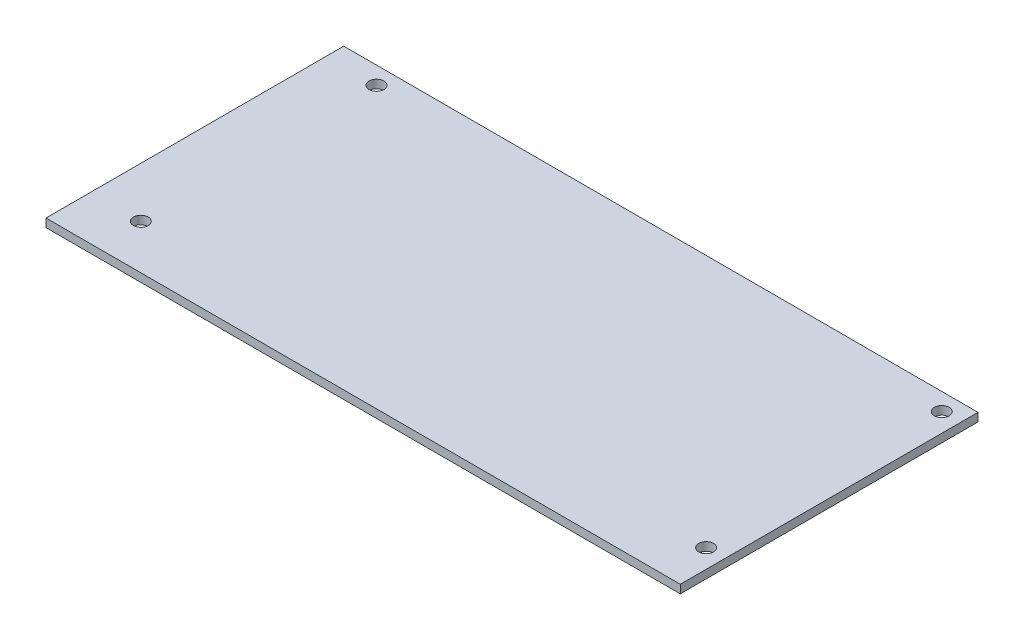
ISO-10303-21;
HEADER;
FILE_DESCRIPTION(('STEP AP214'),'2;1');
FILE_NAME('part.step','',(''),(''),'','','');
FILE_SCHEMA(('AUTOMOTIVE_DESIGN { 1 0 10303 214 1 1 1 1 }'));
ENDSEC;
DATA;
#1=APPLICATION_CONTEXT('core data for automotive mechanical design processes');
#2=APPLICATION_PROTOCOL_DEFINITION('international standard','automotive_design',2000,#1);
#3=PRODUCT_CONTEXT('',#1,'mechanical');
#4=PRODUCT('Part','Part','',(#3));
#5=PRODUCT_RELATED_PRODUCT_CATEGORY('part','',(#4));
#6=PRODUCT_DEFINITION_FORMATION('','',#4);
#7=PRODUCT_DEFINITION_CONTEXT('part definition',#1,'design');
#8=PRODUCT_DEFINITION('design','',#6,#7);
#9=PRODUCT_DEFINITION_SHAPE('','',#8);
#10=(LENGTH_UNIT() NAMED_UNIT(*) SI_UNIT(.MILLI.,.METRE.));
#11=(NAMED_UNIT(*) PLANE_ANGLE_UNIT() SI_UNIT($,.RADIAN.));
#12=(NAMED_UNIT(*) SI_UNIT($,.STERADIAN.) SOLID_ANGLE_UNIT());
#13=UNCERTAINTY_MEASURE_WITH_UNIT(LENGTH_MEASURE(1.E-05),#10,'distance_accuracy_value','');
#14=(GEOMETRIC_REPRESENTATION_CONTEXT(3) GLOBAL_UNCERTAINTY_ASSIGNED_CONTEXT((#13)) GLOBAL_UNIT_ASSIGNED_CONTEXT((#10,
#11,#12)) REPRESENTATION_CONTEXT('',''));
#15=CARTESIAN_POINT('',(0.,0.,0.));
#16=DIRECTION('',(0.,0.,1.));
#17=DIRECTION('',(1.,0.,0.));
#18=AXIS2_PLACEMENT_3D('',#15,#16,#17);
#19=CARTESIAN_POINT('',(-68.5,1.8,-32.15));
#20=DIRECTION('',(1.,0.,0.));
#21=DIRECTION('',(0.,0.,-1.));
#22=AXIS2_PLACEMENT_3D('',#19,#20,#21);
#23=PLANE('',#22);
#24=DIRECTION('',(0.,0.,1.));
#25=VECTOR('',#24,1.);
#26=CARTESIAN_POINT('',(-68.5,0.,-32.15));
#27=LINE('',#26,#25);
#28=CARTESIAN_POINT('',(-68.5,0.,-32.15));
#29=VERTEX_POINT('',#28);
#30=CARTESIAN_POINT('',(-68.5,0.,32.15));
#31=VERTEX_POINT('',#30);
#32=EDGE_CURVE('E99',#29,#31,#27,.T.);
#33=ORIENTED_EDGE('',*,*,#32,.T.);
#34=DIRECTION('',(0.,-1.,0.));
#35=VECTOR('',#34,1.);
#36=CARTESIAN_POINT('',(-68.5,1.8,32.15));
#37=LINE('',#36,#35);
#38=CARTESIAN_POINT('',(-68.5,1.8,32.15));
#39=VERTEX_POINT('',#38);
#40=EDGE_CURVE('E11',#39,#31,#37,.T.);
#41=ORIENTED_EDGE('',*,*,#40,.F.);
#42=DIRECTION('',(0.,0.,1.));
#43=VECTOR('',#42,1.);
#44=CARTESIAN_POINT('',(-68.5,1.8,-32.15));
#45=LINE('',#44,#43);
#46=CARTESIAN_POINT('',(-68.5,1.8,-32.15));
#47=VERTEX_POINT('',#46);
#48=EDGE_CURVE('E86',#47,#39,#45,.T.);
#49=ORIENTED_EDGE('',*,*,#48,.F.);
#50=DIRECTION('',(0.,-1.,0.));
#51=VECTOR('',#50,1.);
#52=CARTESIAN_POINT('',(-68.5,1.8,-32.15));
#53=LINE('',#52,#51);
#54=EDGE_CURVE('E95',#47,#29,#53,.T.);
#55=ORIENTED_EDGE('',*,*,#54,.T.);
#56=EDGE_LOOP('',(#33,#41,#49,#55));
#57=FACE_BOUND('',#56,.T.);
#58=ADVANCED_FACE('F33',(#57),#23,.F.);
#59=CARTESIAN_POINT('',(68.5,1.8,32.15));
#60=DIRECTION('',(0.,0.,-1.));
#61=DIRECTION('',(-1.,0.,0.));
#62=AXIS2_PLACEMENT_3D('',#59,#60,#61);
#63=PLANE('',#62);
#64=DIRECTION('',(1.,0.,0.));
#65=VECTOR('',#64,1.);
#66=CARTESIAN_POINT('',(68.5,0.,32.15));
#67=LINE('',#66,#65);
#68=CARTESIAN_POINT('',(68.5,0.,32.15));
#69=VERTEX_POINT('',#68);
#70=EDGE_CURVE('E90',#31,#69,#67,.T.);
#71=ORIENTED_EDGE('',*,*,#70,.T.);
#72=DIRECTION('',(0.,-1.,0.));
#73=VECTOR('',#72,1.);
#74=CARTESIAN_POINT('',(68.5,1.8,32.15));
#75=LINE('',#74,#73);
#76=CARTESIAN_POINT('',(68.5,1.8,32.15));
#77=VERTEX_POINT('',#76);
#78=EDGE_CURVE('E42',#77,#69,#75,.T.);
#79=ORIENTED_EDGE('',*,*,#78,.F.);
#80=DIRECTION('',(1.,0.,0.));
#81=VECTOR('',#80,1.);
#82=CARTESIAN_POINT('',(68.5,1.8,32.15));
#83=LINE('',#82,#81);
#84=EDGE_CURVE('E81',#39,#77,#83,.T.);
#85=ORIENTED_EDGE('',*,*,#84,.F.);
#86=ORIENTED_EDGE('',*,*,#40,.T.);
#87=EDGE_LOOP('',(#71,#79,#85,#86));
#88=FACE_BOUND('',#87,.T.);
#89=ADVANCED_FACE('F89',(#88),#63,.F.);
#90=CARTESIAN_POINT('',(68.5,1.8,-32.15));
#91=DIRECTION('',(-1.,0.,0.));
#92=DIRECTION('',(0.,0.,1.));
#93=AXIS2_PLACEMENT_3D('',#90,#91,#92);
#94=PLANE('',#93);
#95=DIRECTION('',(0.,0.,-1.));
#96=VECTOR('',#95,1.);
#97=CARTESIAN_POINT('',(68.5,0.,-32.15));
#98=LINE('',#97,#96);
#99=CARTESIAN_POINT('',(68.5,0.,-32.15));
#100=VERTEX_POINT('',#99);
#101=EDGE_CURVE('E68',#69,#100,#98,.T.);
#102=ORIENTED_EDGE('',*,*,#101,.T.);
#103=DIRECTION('',(0.,-1.,0.));
#104=VECTOR('',#103,1.);
#105=CARTESIAN_POINT('',(68.5,1.8,-32.15));
#106=LINE('',#105,#104);
#107=CARTESIAN_POINT('',(68.5,1.8,-32.15));
#108=VERTEX_POINT('',#107);
#109=EDGE_CURVE('E91',#108,#100,#106,.T.);
#110=ORIENTED_EDGE('',*,*,#109,.F.);
#111=DIRECTION('',(0.,0.,-1.));
#112=VECTOR('',#111,1.);
#113=CARTESIAN_POINT('',(68.5,1.8,-32.15));
#114=LINE('',#113,#112);
#115=EDGE_CURVE('E84',#77,#108,#114,.T.);
#116=ORIENTED_EDGE('',*,*,#115,.F.);
#117=ORIENTED_EDGE('',*,*,#78,.T.);
#118=EDGE_LOOP('',(#102,#110,#116,#117));
#119=FACE_BOUND('',#118,.T.);
#120=ADVANCED_FACE('F93',(#119),#94,.F.);
#121=CARTESIAN_POINT('',(68.5,1.8,-32.15));
#122=DIRECTION('',(0.,0.,1.));
#123=DIRECTION('',(1.,0.,0.));
#124=AXIS2_PLACEMENT_3D('',#121,#122,#123);
#125=PLANE('',#124);
#126=DIRECTION('',(-1.,0.,0.));
#127=VECTOR('',#126,1.);
#128=CARTESIAN_POINT('',(68.5,0.,-32.15));
#129=LINE('',#128,#127);
#130=EDGE_CURVE('E74',#100,#29,#129,.T.);
#131=ORIENTED_EDGE('',*,*,#130,.T.);
#132=ORIENTED_EDGE('',*,*,#54,.F.);
#133=DIRECTION('',(-1.,0.,0.));
#134=VECTOR('',#133,1.);
#135=CARTESIAN_POINT('',(68.5,1.8,-32.15));
#136=LINE('',#135,#134);
#137=EDGE_CURVE('E51',#108,#47,#136,.T.);
#138=ORIENTED_EDGE('',*,*,#137,.F.);
#139=ORIENTED_EDGE('',*,*,#109,.T.);
#140=EDGE_LOOP('',(#131,#132,#138,#139));
#141=FACE_BOUND('',#140,.T.);
#142=ADVANCED_FACE('F140',(#141),#125,.F.);
#143=CARTESIAN_POINT('',(0.,1.8,0.));
#144=DIRECTION('',(0.,-1.,0.));
#145=DIRECTION('',(0.,0.,-1.));
#146=AXIS2_PLACEMENT_3D('',#143,#144,#145);
#147=PLANE('',#146);
#148=CARTESIAN_POINT('',(-57.65,1.8,22.52));
#149=DIRECTION('',(0.,1.,0.));
#150=DIRECTION('',(0.,0.,1.));
#151=AXIS2_PLACEMENT_3D('',#148,#149,#150);
#152=CIRCLE('',#151,1.6);
#153=CARTESIAN_POINT('',(-57.65,1.8,24.12));
#154=VERTEX_POINT('',#153);
#155=EDGE_CURVE('E114',#154,#154,#152,.T.);
#156=ORIENTED_EDGE('',*,*,#155,.F.);
#157=EDGE_LOOP('',(#156));
#158=FACE_BOUND('',#157,.T.);
#159=CARTESIAN_POINT('',(64.45,1.8,-28.38));
#160=DIRECTION('',(0.,1.,0.));
#161=DIRECTION('',(0.,0.,1.));
#162=AXIS2_PLACEMENT_3D('',#159,#160,#161);
#163=CIRCLE('',#162,1.6);
#164=CARTESIAN_POINT('',(64.45,1.8,-26.78));
#165=VERTEX_POINT('',#164);
#166=EDGE_CURVE('E129',#165,#165,#163,.T.);
#167=ORIENTED_EDGE('',*,*,#166,.F.);
#168=EDGE_LOOP('',(#167));
#169=FACE_BOUND('',#168,.T.);
#170=CARTESIAN_POINT('',(64.45,1.8,22.52));
#171=DIRECTION('',(0.,1.,0.));
#172=DIRECTION('',(0.,0.,1.));
#173=AXIS2_PLACEMENT_3D('',#170,#171,#172);
#174=CIRCLE('',#173,1.6);
#175=CARTESIAN_POINT('',(64.45,1.8,24.12));
#176=VERTEX_POINT('',#175);
#177=EDGE_CURVE('E126',#176,#176,#174,.T.);
#178=ORIENTED_EDGE('',*,*,#177,.F.);
#179=EDGE_LOOP('',(#178));
#180=FACE_BOUND('',#179,.T.);
#181=CARTESIAN_POINT('',(-57.65,1.8,-28.38));
#182=DIRECTION('',(0.,1.,0.));
#183=DIRECTION('',(0.,0.,1.));
#184=AXIS2_PLACEMENT_3D('',#181,#182,#183);
#185=CIRCLE('',#184,1.6);
#186=CARTESIAN_POINT('',(-57.65,1.8,-26.78));
#187=VERTEX_POINT('',#186);
#188=EDGE_CURVE('E110',#187,#187,#185,.T.);
#189=ORIENTED_EDGE('',*,*,#188,.F.);
#190=EDGE_LOOP('',(#189));
#191=FACE_BOUND('',#190,.T.);
#192=ORIENTED_EDGE('',*,*,#48,.T.);
#193=ORIENTED_EDGE('',*,*,#84,.T.);
#194=ORIENTED_EDGE('',*,*,#115,.T.);
#195=ORIENTED_EDGE('',*,*,#137,.T.);
#196=EDGE_LOOP('',(#192,#193,#194,#195));
#197=FACE_BOUND('',#196,.T.);
#198=ADVANCED_FACE('F82',(#158,#169,#180,#191,#197),#147,.F.);
#199=CARTESIAN_POINT('',(0.,0.,0.));
#200=DIRECTION('',(0.,-1.,0.));
#201=DIRECTION('',(0.,0.,-1.));
#202=AXIS2_PLACEMENT_3D('',#199,#200,#201);
#203=PLANE('',#202);
#204=CARTESIAN_POINT('',(-57.65,0.,22.52));
#205=DIRECTION('',(0.,-1.,0.));
#206=DIRECTION('',(0.,0.,-1.));
#207=AXIS2_PLACEMENT_3D('',#204,#205,#206);
#208=CIRCLE('',#207,1.6);
#209=CARTESIAN_POINT('',(-57.65,0.,20.92));
#210=VERTEX_POINT('',#209);
#211=EDGE_CURVE('E36',#210,#210,#208,.T.);
#212=ORIENTED_EDGE('',*,*,#211,.F.);
#213=EDGE_LOOP('',(#212));
#214=FACE_BOUND('',#213,.T.);
#215=CARTESIAN_POINT('',(64.45,0.,-28.38));
#216=DIRECTION('',(0.,-1.,0.));
#217=DIRECTION('',(0.,0.,-1.));
#218=AXIS2_PLACEMENT_3D('',#215,#216,#217);
#219=CIRCLE('',#218,1.6);
#220=CARTESIAN_POINT('',(64.45,0.,-29.98));
#221=VERTEX_POINT('',#220);
#222=EDGE_CURVE('E113',#221,#221,#219,.T.);
#223=ORIENTED_EDGE('',*,*,#222,.F.);
#224=EDGE_LOOP('',(#223));
#225=FACE_BOUND('',#224,.T.);
#226=CARTESIAN_POINT('',(64.45,0.,22.52));
#227=DIRECTION('',(0.,-1.,0.));
#228=DIRECTION('',(0.,0.,-1.));
#229=AXIS2_PLACEMENT_3D('',#226,#227,#228);
#230=CIRCLE('',#229,1.6);
#231=CARTESIAN_POINT('',(64.45,0.,20.92));
#232=VERTEX_POINT('',#231);
#233=EDGE_CURVE('E111',#232,#232,#230,.T.);
#234=ORIENTED_EDGE('',*,*,#233,.F.);
#235=EDGE_LOOP('',(#234));
#236=FACE_BOUND('',#235,.T.);
#237=CARTESIAN_POINT('',(-57.65,0.,-28.38));
#238=DIRECTION('',(0.,-1.,0.));
#239=DIRECTION('',(0.,0.,-1.));
#240=AXIS2_PLACEMENT_3D('',#237,#238,#239);
#241=CIRCLE('',#240,1.6);
#242=CARTESIAN_POINT('',(-57.65,0.,-29.98));
#243=VERTEX_POINT('',#242);
#244=EDGE_CURVE('E102',#243,#243,#241,.T.);
#245=ORIENTED_EDGE('',*,*,#244,.F.);
#246=EDGE_LOOP('',(#245));
#247=FACE_BOUND('',#246,.T.);
#248=ORIENTED_EDGE('',*,*,#32,.F.);
#249=ORIENTED_EDGE('',*,*,#130,.F.);
#250=ORIENTED_EDGE('',*,*,#101,.F.);
#251=ORIENTED_EDGE('',*,*,#70,.F.);
#252=EDGE_LOOP('',(#248,#249,#250,#251));
#253=FACE_BOUND('',#252,.T.);
#254=ADVANCED_FACE('F139',(#214,#225,#236,#247,#253),#203,.T.);
#255=CARTESIAN_POINT('',(-57.65,-0.2,-28.38));
#256=DIRECTION('',(0.,1.,0.));
#257=DIRECTION('',(0.,0.,1.));
#258=AXIS2_PLACEMENT_3D('',#255,#256,#257);
#259=CYLINDRICAL_SURFACE('',#258,1.6);
#260=ORIENTED_EDGE('',*,*,#244,.T.);
#261=EDGE_LOOP('',(#260));
#262=FACE_BOUND('',#261,.T.);
#263=ORIENTED_EDGE('',*,*,#188,.T.);
#264=EDGE_LOOP('',(#263));
#265=FACE_BOUND('',#264,.T.);
#266=ADVANCED_FACE('F150',(#262,#265),#259,.F.);
#267=CARTESIAN_POINT('',(64.45,-0.2,22.52));
#268=DIRECTION('',(0.,1.,0.));
#269=DIRECTION('',(0.,0.,1.));
#270=AXIS2_PLACEMENT_3D('',#267,#268,#269);
#271=CYLINDRICAL_SURFACE('',#270,1.6);
#272=ORIENTED_EDGE('',*,*,#233,.T.);
#273=EDGE_LOOP('',(#272));
#274=FACE_BOUND('',#273,.T.);
#275=ORIENTED_EDGE('',*,*,#177,.T.);
#276=EDGE_LOOP('',(#275));
#277=FACE_BOUND('',#276,.T.);
#278=ADVANCED_FACE('F147',(#274,#277),#271,.F.);
#279=CARTESIAN_POINT('',(64.45,-0.2,-28.38));
#280=DIRECTION('',(0.,1.,0.));
#281=DIRECTION('',(0.,0.,1.));
#282=AXIS2_PLACEMENT_3D('',#279,#280,#281);
#283=CYLINDRICAL_SURFACE('',#282,1.6);
#284=ORIENTED_EDGE('',*,*,#222,.T.);
#285=EDGE_LOOP('',(#284));
#286=FACE_BOUND('',#285,.T.);
#287=ORIENTED_EDGE('',*,*,#166,.T.);
#288=EDGE_LOOP('',(#287));
#289=FACE_BOUND('',#288,.T.);
#290=ADVANCED_FACE('F149',(#286,#289),#283,.F.);
#291=CARTESIAN_POINT('',(-57.65,-0.2,22.52));
#292=DIRECTION('',(0.,1.,0.));
#293=DIRECTION('',(0.,0.,1.));
#294=AXIS2_PLACEMENT_3D('',#291,#292,#293);
#295=CYLINDRICAL_SURFACE('',#294,1.6);
#296=ORIENTED_EDGE('',*,*,#211,.T.);
#297=EDGE_LOOP('',(#296));
#298=FACE_BOUND('',#297,.T.);
#299=ORIENTED_EDGE('',*,*,#155,.T.);
#300=EDGE_LOOP('',(#299));
#301=FACE_BOUND('',#300,.T.);
#302=ADVANCED_FACE('F135',(#298,#301),#295,.F.);
#303=CLOSED_SHELL('',(#58,#89,#120,#142,#198,#254,#266,#278,#290,#302));
#304=MANIFOLD_SOLID_BREP('B2',#303);
#305=ADVANCED_BREP_SHAPE_REPRESENTATION('',(#18,#304),#14);
#306=SHAPE_DEFINITION_REPRESENTATION(#9,#305);
ENDSEC;
END-ISO-10303-21;
